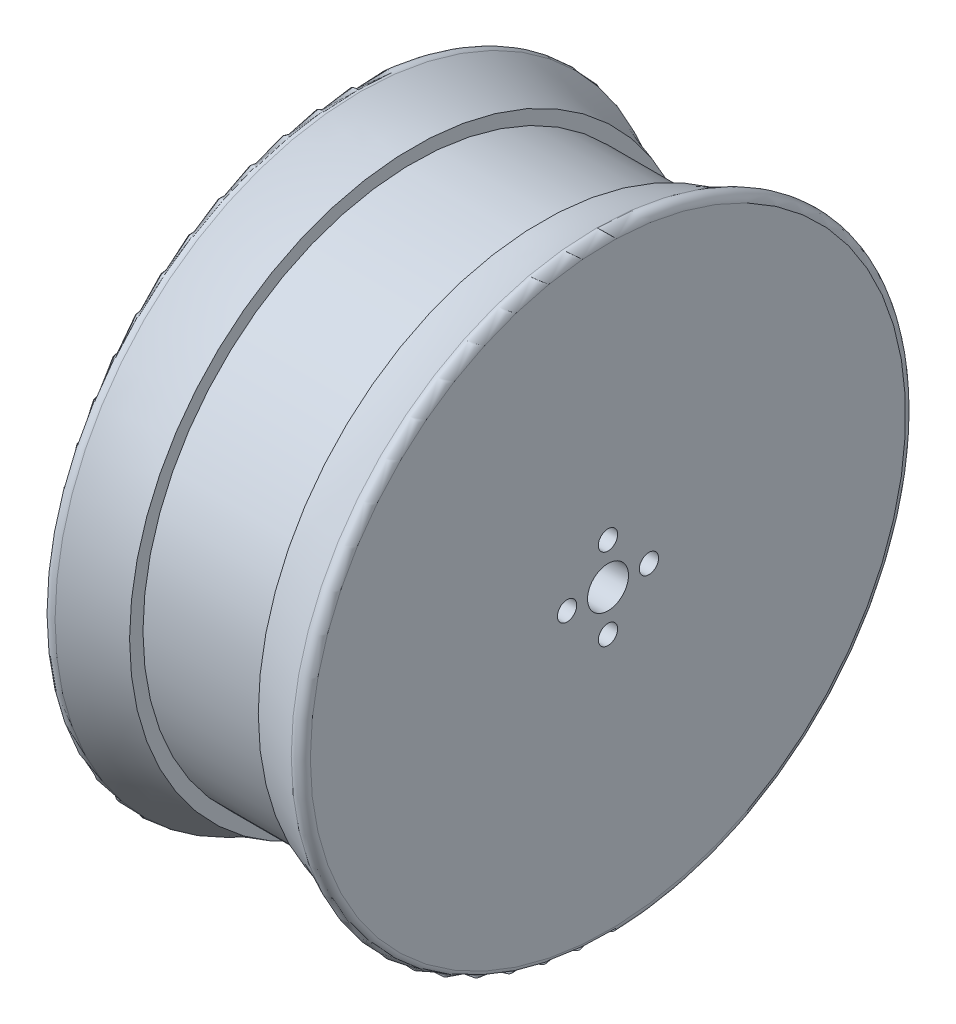
ISO-10303-21;
HEADER;
FILE_DESCRIPTION(('STEP AP214'),'2;1');
FILE_NAME('part.step','',(''),(''),'','','');
FILE_SCHEMA(('AUTOMOTIVE_DESIGN { 1 0 10303 214 1 1 1 1 }'));
ENDSEC;
DATA;
#1=APPLICATION_CONTEXT('core data for automotive mechanical design processes');
#2=APPLICATION_PROTOCOL_DEFINITION('international standard','automotive_design',2000,#1);
#3=PRODUCT_CONTEXT('',#1,'mechanical');
#4=PRODUCT('Part','Part','',(#3));
#5=PRODUCT_RELATED_PRODUCT_CATEGORY('part','',(#4));
#6=PRODUCT_DEFINITION_FORMATION('','',#4);
#7=PRODUCT_DEFINITION_CONTEXT('part definition',#1,'design');
#8=PRODUCT_DEFINITION('design','',#6,#7);
#9=PRODUCT_DEFINITION_SHAPE('','',#8);
#10=(LENGTH_UNIT() NAMED_UNIT(*) SI_UNIT(.MILLI.,.METRE.));
#11=(NAMED_UNIT(*) PLANE_ANGLE_UNIT() SI_UNIT($,.RADIAN.));
#12=(NAMED_UNIT(*) SI_UNIT($,.STERADIAN.) SOLID_ANGLE_UNIT());
#13=UNCERTAINTY_MEASURE_WITH_UNIT(LENGTH_MEASURE(1.E-05),#10,'distance_accuracy_value','');
#14=(GEOMETRIC_REPRESENTATION_CONTEXT(3) GLOBAL_UNCERTAINTY_ASSIGNED_CONTEXT((#13)) GLOBAL_UNIT_ASSIGNED_CONTEXT((#10,
#11,#12)) REPRESENTATION_CONTEXT('',''));
#15=CARTESIAN_POINT('',(0.,0.,0.));
#16=DIRECTION('',(0.,0.,1.));
#17=DIRECTION('',(1.,0.,0.));
#18=AXIS2_PLACEMENT_3D('',#15,#16,#17);
#19=CARTESIAN_POINT('',(25.4,0.,0.));
#20=DIRECTION('',(1.,0.,0.));
#21=DIRECTION('',(0.,0.,-1.));
#22=AXIS2_PLACEMENT_3D('',#19,#20,#21);
#23=PLANE('',#22);
#24=CARTESIAN_POINT('',(25.4,-4.57011557697138E-13,7.99999999999954));
#25=DIRECTION('',(1.,0.,0.));
#26=DIRECTION('',(0.,0.,-1.));
#27=AXIS2_PLACEMENT_3D('',#24,#25,#26);
#28=CIRCLE('',#27,1.88500000000098);
#29=CARTESIAN_POINT('',(25.4,-4.57011557697138E-13,6.11499999999856));
#30=VERTEX_POINT('',#29);
#31=EDGE_CURVE('E87',#30,#30,#28,.T.);
#32=ORIENTED_EDGE('',*,*,#31,.F.);
#33=EDGE_LOOP('',(#32));
#34=FACE_BOUND('',#33,.T.);
#35=CARTESIAN_POINT('',(25.4,-8.,-9.12063680515641E-13));
#36=DIRECTION('',(1.,0.,0.));
#37=DIRECTION('',(0.,0.,-1.));
#38=AXIS2_PLACEMENT_3D('',#35,#36,#37);
#39=CIRCLE('',#38,1.88500000000098);
#40=CARTESIAN_POINT('',(25.4,-8.,-1.88500000000189));
#41=VERTEX_POINT('',#40);
#42=EDGE_CURVE('E81',#41,#41,#39,.T.);
#43=ORIENTED_EDGE('',*,*,#42,.F.);
#44=EDGE_LOOP('',(#43));
#45=FACE_BOUND('',#44,.T.);
#46=CARTESIAN_POINT('',(25.4,4.56031840257821E-13,-8.00000000000045));
#47=DIRECTION('',(1.,0.,0.));
#48=DIRECTION('',(0.,0.,-1.));
#49=AXIS2_PLACEMENT_3D('',#46,#47,#48);
#50=CIRCLE('',#49,1.88500000000098);
#51=CARTESIAN_POINT('',(25.4,4.56031840257821E-13,-9.88500000000144));
#52=VERTEX_POINT('',#51);
#53=EDGE_CURVE('E75',#52,#52,#50,.T.);
#54=ORIENTED_EDGE('',*,*,#53,.F.);
#55=EDGE_LOOP('',(#54));
#56=FACE_BOUND('',#55,.T.);
#57=CARTESIAN_POINT('',(25.4,8.,0.));
#58=DIRECTION('',(1.,0.,0.));
#59=DIRECTION('',(0.,0.,-1.));
#60=AXIS2_PLACEMENT_3D('',#57,#58,#59);
#61=CIRCLE('',#60,1.88500000000098);
#62=CARTESIAN_POINT('',(25.4,8.,-1.88500000000098));
#63=VERTEX_POINT('',#62);
#64=EDGE_CURVE('E69',#63,#63,#61,.T.);
#65=ORIENTED_EDGE('',*,*,#64,.F.);
#66=EDGE_LOOP('',(#65));
#67=FACE_BOUND('',#66,.T.);
#68=CARTESIAN_POINT('',(25.4,0.,0.));
#69=DIRECTION('',(1.,0.,0.));
#70=DIRECTION('',(0.,0.,-1.));
#71=AXIS2_PLACEMENT_3D('',#68,#69,#70);
#72=CIRCLE('',#71,4.);
#73=CARTESIAN_POINT('',(25.4,0.,-4.));
#74=VERTEX_POINT('',#73);
#75=EDGE_CURVE('E63',#74,#74,#72,.T.);
#76=ORIENTED_EDGE('',*,*,#75,.F.);
#77=EDGE_LOOP('',(#76));
#78=FACE_BOUND('',#77,.T.);
#79=CARTESIAN_POINT('',(25.4,0.,0.));
#80=DIRECTION('',(-1.,0.,0.));
#81=DIRECTION('',(0.,0.,1.));
#82=AXIS2_PLACEMENT_3D('',#79,#80,#81);
#83=CIRCLE('',#82,58.1709625265739);
#84=CARTESIAN_POINT('',(25.4,0.,58.1709625265739));
#85=VERTEX_POINT('',#84);
#86=EDGE_CURVE('E10',#85,#85,#83,.T.);
#87=ORIENTED_EDGE('',*,*,#86,.F.);
#88=EDGE_LOOP('',(#87));
#89=FACE_BOUND('',#88,.T.);
#90=ADVANCED_FACE('F31',(#34,#45,#56,#67,#78,#89),#23,.T.);
#91=CARTESIAN_POINT('',(23.8125,0.,0.));
#92=DIRECTION('',(-1.,0.,0.));
#93=DIRECTION('',(0.,0.,1.));
#94=AXIS2_PLACEMENT_3D('',#91,#92,#93);
#95=TOROIDAL_SURFACE('',#94,58.1709625265739,1.5875);
#96=ORIENTED_EDGE('',*,*,#86,.T.);
#97=EDGE_LOOP('',(#96));
#98=FACE_BOUND('',#97,.T.);
#99=CARTESIAN_POINT('',(23.0768669418917,0.,0.));
#100=DIRECTION('',(-1.,0.,0.));
#101=DIRECTION('',(0.,0.,1.));
#102=AXIS2_PLACEMENT_3D('',#99,#100,#101);
#103=CIRCLE('',#102,59.57773196533);
#104=CARTESIAN_POINT('',(23.0768669418917,0.,59.57773196533));
#105=VERTEX_POINT('',#104);
#106=EDGE_CURVE('E37',#105,#105,#103,.T.);
#107=ORIENTED_EDGE('',*,*,#106,.F.);
#108=EDGE_LOOP('',(#107));
#109=FACE_BOUND('',#108,.T.);
#110=ADVANCED_FACE('F105',(#98,#109),#95,.T.);
#111=CARTESIAN_POINT('',(0.,0.,0.));
#112=DIRECTION('',(-1.,0.,0.));
#113=DIRECTION('',(0.,0.,1.));
#114=AXIS2_PLACEMENT_3D('',#111,#112,#113);
#115=TOROIDAL_SURFACE('',#114,103.7082,49.799999968);
#116=ORIENTED_EDGE('',*,*,#106,.T.);
#117=EDGE_LOOP('',(#116));
#118=FACE_BOUND('',#117,.T.);
#119=CARTESIAN_POINT('',(12.573,0.,0.));
#120=DIRECTION('',(-1.,0.,0.));
#121=DIRECTION('',(0.,0.,1.));
#122=AXIS2_PLACEMENT_3D('',#119,#120,#121);
#123=CIRCLE('',#122,55.5214832845731);
#124=CARTESIAN_POINT('',(12.573,0.,55.5214832845731));
#125=VERTEX_POINT('',#124);
#126=EDGE_CURVE('E41',#125,#125,#123,.T.);
#127=ORIENTED_EDGE('',*,*,#126,.F.);
#128=EDGE_LOOP('',(#127));
#129=FACE_BOUND('',#128,.T.);
#130=ADVANCED_FACE('F150',(#118,#129),#115,.F.);
#131=CARTESIAN_POINT('',(12.573,-52.9082,0.));
#132=DIRECTION('',(-1.,0.,0.));
#133=DIRECTION('',(0.,0.,1.));
#134=AXIS2_PLACEMENT_3D('',#131,#132,#133);
#135=PLANE('',#134);
#136=ORIENTED_EDGE('',*,*,#126,.T.);
#137=EDGE_LOOP('',(#136));
#138=FACE_BOUND('',#137,.T.);
#139=CARTESIAN_POINT('',(12.573,0.,0.));
#140=DIRECTION('',(-1.,0.,0.));
#141=DIRECTION('',(0.,0.,1.));
#142=AXIS2_PLACEMENT_3D('',#139,#140,#141);
#143=CIRCLE('',#142,52.9082);
#144=CARTESIAN_POINT('',(12.573,0.,52.9082));
#145=VERTEX_POINT('',#144);
#146=EDGE_CURVE('E45',#145,#145,#143,.T.);
#147=ORIENTED_EDGE('',*,*,#146,.F.);
#148=EDGE_LOOP('',(#147));
#149=FACE_BOUND('',#148,.T.);
#150=ADVANCED_FACE('F146',(#138,#149),#135,.T.);
#151=CARTESIAN_POINT('',(-40.905271883208,0.,0.));
#152=DIRECTION('',(-1.,0.,0.));
#153=DIRECTION('',(0.,0.,1.));
#154=AXIS2_PLACEMENT_3D('',#151,#152,#153);
#155=CYLINDRICAL_SURFACE('',#154,52.9082);
#156=ORIENTED_EDGE('',*,*,#146,.T.);
#157=EDGE_LOOP('',(#156));
#158=FACE_BOUND('',#157,.T.);
#159=CARTESIAN_POINT('',(-12.573,0.,0.));
#160=DIRECTION('',(-1.,0.,0.));
#161=DIRECTION('',(0.,0.,1.));
#162=AXIS2_PLACEMENT_3D('',#159,#160,#161);
#163=CIRCLE('',#162,52.9082);
#164=CARTESIAN_POINT('',(-12.573,0.,52.9082));
#165=VERTEX_POINT('',#164);
#166=EDGE_CURVE('E50',#165,#165,#163,.T.);
#167=ORIENTED_EDGE('',*,*,#166,.F.);
#168=EDGE_LOOP('',(#167));
#169=FACE_BOUND('',#168,.T.);
#170=ADVANCED_FACE('F142',(#158,#169),#155,.T.);
#171=CARTESIAN_POINT('',(-12.573,-52.9082,0.));
#172=DIRECTION('',(1.,0.,0.));
#173=DIRECTION('',(0.,0.,-1.));
#174=AXIS2_PLACEMENT_3D('',#171,#172,#173);
#175=PLANE('',#174);
#176=ORIENTED_EDGE('',*,*,#166,.T.);
#177=EDGE_LOOP('',(#176));
#178=FACE_BOUND('',#177,.T.);
#179=CARTESIAN_POINT('',(-12.573,0.,0.));
#180=DIRECTION('',(-1.,0.,0.));
#181=DIRECTION('',(0.,0.,1.));
#182=AXIS2_PLACEMENT_3D('',#179,#180,#181);
#183=CIRCLE('',#182,55.5214832845731);
#184=CARTESIAN_POINT('',(-12.573,0.,55.5214832845731));
#185=VERTEX_POINT('',#184);
#186=EDGE_CURVE('E53',#185,#185,#183,.T.);
#187=ORIENTED_EDGE('',*,*,#186,.F.);
#188=EDGE_LOOP('',(#187));
#189=FACE_BOUND('',#188,.T.);
#190=ADVANCED_FACE('F138',(#178,#189),#175,.T.);
#191=CARTESIAN_POINT('',(0.,0.,0.));
#192=DIRECTION('',(-1.,0.,0.));
#193=DIRECTION('',(0.,0.,1.));
#194=AXIS2_PLACEMENT_3D('',#191,#192,#193);
#195=TOROIDAL_SURFACE('',#194,103.7082,49.799999968);
#196=ORIENTED_EDGE('',*,*,#186,.T.);
#197=EDGE_LOOP('',(#196));
#198=FACE_BOUND('',#197,.T.);
#199=CARTESIAN_POINT('',(-23.0768669418917,0.,0.));
#200=DIRECTION('',(-1.,0.,0.));
#201=DIRECTION('',(0.,0.,1.));
#202=AXIS2_PLACEMENT_3D('',#199,#200,#201);
#203=CIRCLE('',#202,59.57773196533);
#204=CARTESIAN_POINT('',(-23.0768669418917,0.,59.57773196533));
#205=VERTEX_POINT('',#204);
#206=EDGE_CURVE('E56',#205,#205,#203,.T.);
#207=ORIENTED_EDGE('',*,*,#206,.F.);
#208=EDGE_LOOP('',(#207));
#209=FACE_BOUND('',#208,.T.);
#210=ADVANCED_FACE('F134',(#198,#209),#195,.F.);
#211=CARTESIAN_POINT('',(-23.8125,0.,0.));
#212=DIRECTION('',(-1.,0.,0.));
#213=DIRECTION('',(0.,0.,1.));
#214=AXIS2_PLACEMENT_3D('',#211,#212,#213);
#215=TOROIDAL_SURFACE('',#214,58.1709625265739,1.5875);
#216=ORIENTED_EDGE('',*,*,#206,.T.);
#217=EDGE_LOOP('',(#216));
#218=FACE_BOUND('',#217,.T.);
#219=CARTESIAN_POINT('',(-25.4,0.,0.));
#220=DIRECTION('',(-1.,0.,0.));
#221=DIRECTION('',(0.,0.,1.));
#222=AXIS2_PLACEMENT_3D('',#219,#220,#221);
#223=CIRCLE('',#222,58.1709625265739);
#224=CARTESIAN_POINT('',(-25.4,0.,58.1709625265739));
#225=VERTEX_POINT('',#224);
#226=EDGE_CURVE('E59',#225,#225,#223,.T.);
#227=ORIENTED_EDGE('',*,*,#226,.F.);
#228=EDGE_LOOP('',(#227));
#229=FACE_BOUND('',#228,.T.);
#230=ADVANCED_FACE('F127',(#218,#229),#215,.T.);
#231=CARTESIAN_POINT('',(-25.4,0.,0.));
#232=DIRECTION('',(-1.,0.,0.));
#233=DIRECTION('',(0.,0.,1.));
#234=AXIS2_PLACEMENT_3D('',#231,#232,#233);
#235=PLANE('',#234);
#236=CARTESIAN_POINT('',(-25.4,-4.57011557697138E-13,7.99999999999954));
#237=DIRECTION('',(1.,0.,0.));
#238=DIRECTION('',(0.,0.,-1.));
#239=AXIS2_PLACEMENT_3D('',#236,#237,#238);
#240=CIRCLE('',#239,1.88500000000098);
#241=CARTESIAN_POINT('',(-25.4,-4.57011557697138E-13,6.11499999999856));
#242=VERTEX_POINT('',#241);
#243=EDGE_CURVE('E84',#242,#242,#240,.T.);
#244=ORIENTED_EDGE('',*,*,#243,.T.);
#245=EDGE_LOOP('',(#244));
#246=FACE_BOUND('',#245,.T.);
#247=CARTESIAN_POINT('',(-25.4,-8.,-9.12063680515641E-13));
#248=DIRECTION('',(1.,0.,0.));
#249=DIRECTION('',(0.,0.,-1.));
#250=AXIS2_PLACEMENT_3D('',#247,#248,#249);
#251=CIRCLE('',#250,1.88500000000098);
#252=CARTESIAN_POINT('',(-25.4,-8.,-1.88500000000189));
#253=VERTEX_POINT('',#252);
#254=EDGE_CURVE('E78',#253,#253,#251,.T.);
#255=ORIENTED_EDGE('',*,*,#254,.T.);
#256=EDGE_LOOP('',(#255));
#257=FACE_BOUND('',#256,.T.);
#258=CARTESIAN_POINT('',(-25.4,4.56031840257821E-13,-8.00000000000045));
#259=DIRECTION('',(1.,0.,0.));
#260=DIRECTION('',(0.,0.,-1.));
#261=AXIS2_PLACEMENT_3D('',#258,#259,#260);
#262=CIRCLE('',#261,1.88500000000098);
#263=CARTESIAN_POINT('',(-25.4,4.56031840257821E-13,-9.88500000000144));
#264=VERTEX_POINT('',#263);
#265=EDGE_CURVE('E72',#264,#264,#262,.T.);
#266=ORIENTED_EDGE('',*,*,#265,.T.);
#267=EDGE_LOOP('',(#266));
#268=FACE_BOUND('',#267,.T.);
#269=CARTESIAN_POINT('',(-25.4,8.,0.));
#270=DIRECTION('',(1.,0.,0.));
#271=DIRECTION('',(0.,0.,-1.));
#272=AXIS2_PLACEMENT_3D('',#269,#270,#271);
#273=CIRCLE('',#272,1.88500000000098);
#274=CARTESIAN_POINT('',(-25.4,8.,-1.88500000000098));
#275=VERTEX_POINT('',#274);
#276=EDGE_CURVE('E66',#275,#275,#273,.T.);
#277=ORIENTED_EDGE('',*,*,#276,.T.);
#278=EDGE_LOOP('',(#277));
#279=FACE_BOUND('',#278,.T.);
#280=CARTESIAN_POINT('',(-25.4,0.,0.));
#281=DIRECTION('',(1.,0.,0.));
#282=DIRECTION('',(0.,0.,-1.));
#283=AXIS2_PLACEMENT_3D('',#280,#281,#282);
#284=CIRCLE('',#283,4.);
#285=CARTESIAN_POINT('',(-25.4,0.,-4.));
#286=VERTEX_POINT('',#285);
#287=EDGE_CURVE('E62',#286,#286,#284,.T.);
#288=ORIENTED_EDGE('',*,*,#287,.T.);
#289=EDGE_LOOP('',(#288));
#290=FACE_BOUND('',#289,.T.);
#291=ORIENTED_EDGE('',*,*,#226,.T.);
#292=EDGE_LOOP('',(#291));
#293=FACE_BOUND('',#292,.T.);
#294=ADVANCED_FACE('F93',(#246,#257,#268,#279,#290,#293),#235,.T.);
#295=CARTESIAN_POINT('',(-25.4,0.,0.));
#296=DIRECTION('',(1.,0.,0.));
#297=DIRECTION('',(0.,0.,-1.));
#298=AXIS2_PLACEMENT_3D('',#295,#296,#297);
#299=CYLINDRICAL_SURFACE('',#298,4.);
#300=ORIENTED_EDGE('',*,*,#287,.F.);
#301=EDGE_LOOP('',(#300));
#302=FACE_BOUND('',#301,.T.);
#303=ORIENTED_EDGE('',*,*,#75,.T.);
#304=EDGE_LOOP('',(#303));
#305=FACE_BOUND('',#304,.T.);
#306=ADVANCED_FACE('F115',(#302,#305),#299,.F.);
#307=CARTESIAN_POINT('',(-25.4,8.,0.));
#308=DIRECTION('',(1.,0.,0.));
#309=DIRECTION('',(0.,0.,-1.));
#310=AXIS2_PLACEMENT_3D('',#307,#308,#309);
#311=CYLINDRICAL_SURFACE('',#310,1.88500000000098);
#312=ORIENTED_EDGE('',*,*,#276,.F.);
#313=EDGE_LOOP('',(#312));
#314=FACE_BOUND('',#313,.T.);
#315=ORIENTED_EDGE('',*,*,#64,.T.);
#316=EDGE_LOOP('',(#315));
#317=FACE_BOUND('',#316,.T.);
#318=ADVANCED_FACE('F117',(#314,#317),#311,.F.);
#319=CARTESIAN_POINT('',(-25.4,4.56031840257821E-13,-8.00000000000045));
#320=DIRECTION('',(1.,0.,0.));
#321=DIRECTION('',(0.,0.,-1.));
#322=AXIS2_PLACEMENT_3D('',#319,#320,#321);
#323=CYLINDRICAL_SURFACE('',#322,1.88500000000098);
#324=ORIENTED_EDGE('',*,*,#265,.F.);
#325=EDGE_LOOP('',(#324));
#326=FACE_BOUND('',#325,.T.);
#327=ORIENTED_EDGE('',*,*,#53,.T.);
#328=EDGE_LOOP('',(#327));
#329=FACE_BOUND('',#328,.T.);
#330=ADVANCED_FACE('F124',(#326,#329),#323,.F.);
#331=CARTESIAN_POINT('',(-25.4,-8.,-9.12063680515641E-13));
#332=DIRECTION('',(1.,0.,0.));
#333=DIRECTION('',(0.,0.,-1.));
#334=AXIS2_PLACEMENT_3D('',#331,#332,#333);
#335=CYLINDRICAL_SURFACE('',#334,1.88500000000098);
#336=ORIENTED_EDGE('',*,*,#254,.F.);
#337=EDGE_LOOP('',(#336));
#338=FACE_BOUND('',#337,.T.);
#339=ORIENTED_EDGE('',*,*,#42,.T.);
#340=EDGE_LOOP('',(#339));
#341=FACE_BOUND('',#340,.T.);
#342=ADVANCED_FACE('F99',(#338,#341),#335,.F.);
#343=CARTESIAN_POINT('',(-25.4,-4.57011557697138E-13,7.99999999999954));
#344=DIRECTION('',(1.,0.,0.));
#345=DIRECTION('',(0.,0.,-1.));
#346=AXIS2_PLACEMENT_3D('',#343,#344,#345);
#347=CYLINDRICAL_SURFACE('',#346,1.88500000000098);
#348=ORIENTED_EDGE('',*,*,#243,.F.);
#349=EDGE_LOOP('',(#348));
#350=FACE_BOUND('',#349,.T.);
#351=ORIENTED_EDGE('',*,*,#31,.T.);
#352=EDGE_LOOP('',(#351));
#353=FACE_BOUND('',#352,.T.);
#354=ADVANCED_FACE('F96',(#350,#353),#347,.F.);
#355=CLOSED_SHELL('',(#90,#110,#130,#150,#170,#190,#210,#230,#294,#306,#318,#330,#342,#354));
#356=MANIFOLD_SOLID_BREP('B2',#355);
#357=ADVANCED_BREP_SHAPE_REPRESENTATION('',(#18,#356),#14);
#358=SHAPE_DEFINITION_REPRESENTATION(#9,#357);
ENDSEC;
END-ISO-10303-21;
